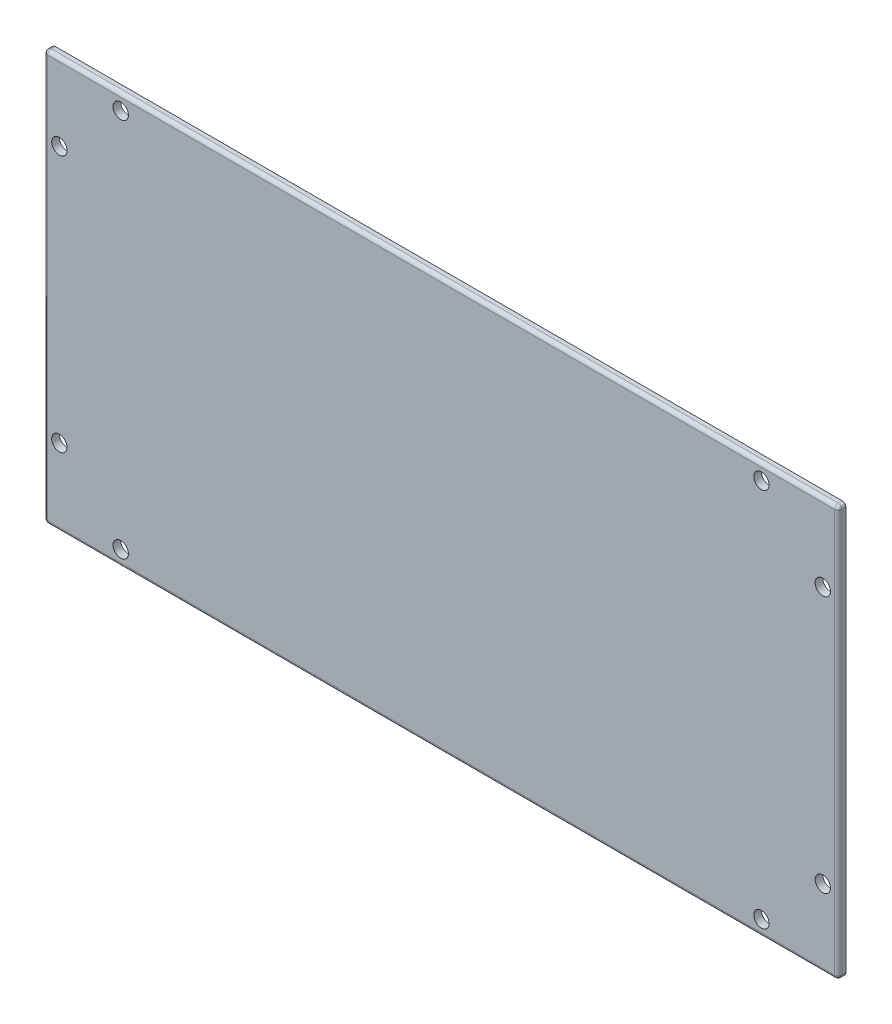
ISO-10303-21;
HEADER;
FILE_DESCRIPTION(('STEP AP214'),'2;1');
FILE_NAME('part.step','',(''),(''),'','','');
FILE_SCHEMA(('AUTOMOTIVE_DESIGN { 1 0 10303 214 1 1 1 1 }'));
ENDSEC;
DATA;
#1=APPLICATION_CONTEXT('core data for automotive mechanical design processes');
#2=APPLICATION_PROTOCOL_DEFINITION('international standard','automotive_design',2000,#1);
#3=PRODUCT_CONTEXT('',#1,'mechanical');
#4=PRODUCT('Part','Part','',(#3));
#5=PRODUCT_RELATED_PRODUCT_CATEGORY('part','',(#4));
#6=PRODUCT_DEFINITION_FORMATION('','',#4);
#7=PRODUCT_DEFINITION_CONTEXT('part definition',#1,'design');
#8=PRODUCT_DEFINITION('design','',#6,#7);
#9=PRODUCT_DEFINITION_SHAPE('','',#8);
#10=(LENGTH_UNIT() NAMED_UNIT(*) SI_UNIT(.MILLI.,.METRE.));
#11=(NAMED_UNIT(*) PLANE_ANGLE_UNIT() SI_UNIT($,.RADIAN.));
#12=(NAMED_UNIT(*) SI_UNIT($,.STERADIAN.) SOLID_ANGLE_UNIT());
#13=UNCERTAINTY_MEASURE_WITH_UNIT(LENGTH_MEASURE(1.E-05),#10,'distance_accuracy_value','');
#14=(GEOMETRIC_REPRESENTATION_CONTEXT(3) GLOBAL_UNCERTAINTY_ASSIGNED_CONTEXT((#13)) GLOBAL_UNIT_ASSIGNED_CONTEXT((#10,
#11,#12)) REPRESENTATION_CONTEXT('',''));
#15=CARTESIAN_POINT('',(0.,0.,0.));
#16=DIRECTION('',(0.,0.,1.));
#17=DIRECTION('',(1.,0.,0.));
#18=AXIS2_PLACEMENT_3D('',#15,#16,#17);
#19=CARTESIAN_POINT('',(0.,0.,0.));
#20=DIRECTION('',(0.,0.,1.));
#21=DIRECTION('',(1.,0.,0.));
#22=AXIS2_PLACEMENT_3D('',#19,#20,#21);
#23=PLANE('',#22);
#24=CARTESIAN_POINT('',(-497.4625,167.4625,0.));
#25=DIRECTION('',(0.,0.,-1.));
#26=DIRECTION('',(-1.,0.,0.));
#27=AXIS2_PLACEMENT_3D('',#24,#25,#26);
#28=CIRCLE('',#27,10.);
#29=CARTESIAN_POINT('',(-507.4625,167.4625,0.));
#30=VERTEX_POINT('',#29);
#31=EDGE_CURVE('E555',#30,#30,#28,.T.);
#32=ORIENTED_EDGE('',*,*,#31,.F.);
#33=EDGE_LOOP('',(#32));
#34=FACE_BOUND('',#33,.T.);
#35=CARTESIAN_POINT('',(-417.4625,-247.4625,0.));
#36=DIRECTION('',(0.,0.,-1.));
#37=DIRECTION('',(-1.,0.,0.));
#38=AXIS2_PLACEMENT_3D('',#35,#36,#37);
#39=CIRCLE('',#38,10.);
#40=CARTESIAN_POINT('',(-427.4625,-247.4625,0.));
#41=VERTEX_POINT('',#40);
#42=EDGE_CURVE('E563',#41,#41,#39,.T.);
#43=ORIENTED_EDGE('',*,*,#42,.F.);
#44=EDGE_LOOP('',(#43));
#45=FACE_BOUND('',#44,.T.);
#46=CARTESIAN_POINT('',(-497.4625,-167.4625,0.));
#47=DIRECTION('',(0.,0.,-1.));
#48=DIRECTION('',(-1.,0.,0.));
#49=AXIS2_PLACEMENT_3D('',#46,#47,#48);
#50=CIRCLE('',#49,10.);
#51=CARTESIAN_POINT('',(-507.4625,-167.4625,0.));
#52=VERTEX_POINT('',#51);
#53=EDGE_CURVE('E569',#52,#52,#50,.T.);
#54=ORIENTED_EDGE('',*,*,#53,.F.);
#55=EDGE_LOOP('',(#54));
#56=FACE_BOUND('',#55,.T.);
#57=CARTESIAN_POINT('',(497.4625,-167.4625,0.));
#58=DIRECTION('',(0.,0.,-1.));
#59=DIRECTION('',(-1.,0.,0.));
#60=AXIS2_PLACEMENT_3D('',#57,#58,#59);
#61=CIRCLE('',#60,10.);
#62=CARTESIAN_POINT('',(487.4625,-167.4625,0.));
#63=VERTEX_POINT('',#62);
#64=EDGE_CURVE('E581',#63,#63,#61,.T.);
#65=ORIENTED_EDGE('',*,*,#64,.F.);
#66=EDGE_LOOP('',(#65));
#67=FACE_BOUND('',#66,.T.);
#68=CARTESIAN_POINT('',(417.4625,247.4625,0.));
#69=DIRECTION('',(0.,0.,-1.));
#70=DIRECTION('',(-1.,0.,0.));
#71=AXIS2_PLACEMENT_3D('',#68,#69,#70);
#72=CIRCLE('',#71,10.);
#73=CARTESIAN_POINT('',(407.4625,247.4625,0.));
#74=VERTEX_POINT('',#73);
#75=EDGE_CURVE('E587',#74,#74,#72,.T.);
#76=ORIENTED_EDGE('',*,*,#75,.F.);
#77=EDGE_LOOP('',(#76));
#78=FACE_BOUND('',#77,.T.);
#79=CARTESIAN_POINT('',(497.4625,167.4625,0.));
#80=DIRECTION('',(0.,0.,-1.));
#81=DIRECTION('',(-1.,0.,0.));
#82=AXIS2_PLACEMENT_3D('',#79,#80,#81);
#83=CIRCLE('',#82,10.);
#84=CARTESIAN_POINT('',(487.4625,167.4625,0.));
#85=VERTEX_POINT('',#84);
#86=EDGE_CURVE('E209',#85,#85,#83,.T.);
#87=ORIENTED_EDGE('',*,*,#86,.F.);
#88=EDGE_LOOP('',(#87));
#89=FACE_BOUND('',#88,.T.);
#90=DIRECTION('',(0.,1.,0.));
#91=VECTOR('',#90,1.);
#92=CARTESIAN_POINT('',(517.4625,-267.4625,0.));
#93=LINE('',#92,#91);
#94=CARTESIAN_POINT('',(517.4625,-262.7025,0.));
#95=VERTEX_POINT('',#94);
#96=CARTESIAN_POINT('',(517.4625,262.7025,0.));
#97=VERTEX_POINT('',#96);
#98=EDGE_CURVE('E219',#95,#97,#93,.T.);
#99=ORIENTED_EDGE('',*,*,#98,.F.);
#100=CARTESIAN_POINT('',(512.7025,-262.7025,0.));
#101=DIRECTION('',(0.,0.,1.));
#102=DIRECTION('',(1.,0.,0.));
#103=AXIS2_PLACEMENT_3D('',#100,#101,#102);
#104=CIRCLE('',#103,4.76);
#105=CARTESIAN_POINT('',(512.7025,-267.4625,0.));
#106=VERTEX_POINT('',#105);
#107=EDGE_CURVE('E187',#95,#106,#104,.F.);
#108=ORIENTED_EDGE('',*,*,#107,.T.);
#109=DIRECTION('',(1.,0.,0.));
#110=VECTOR('',#109,1.);
#111=CARTESIAN_POINT('',(-517.4625,-267.4625,0.));
#112=LINE('',#111,#110);
#113=CARTESIAN_POINT('',(-512.7025,-267.4625,0.));
#114=VERTEX_POINT('',#113);
#115=EDGE_CURVE('E201',#114,#106,#112,.T.);
#116=ORIENTED_EDGE('',*,*,#115,.F.);
#117=CARTESIAN_POINT('',(-512.7025,-262.7025,0.));
#118=DIRECTION('',(0.,0.,1.));
#119=DIRECTION('',(1.,0.,0.));
#120=AXIS2_PLACEMENT_3D('',#117,#118,#119);
#121=CIRCLE('',#120,4.76);
#122=CARTESIAN_POINT('',(-517.4625,-262.7025,0.));
#123=VERTEX_POINT('',#122);
#124=EDGE_CURVE('E184',#114,#123,#121,.F.);
#125=ORIENTED_EDGE('',*,*,#124,.T.);
#126=DIRECTION('',(0.,1.,0.));
#127=VECTOR('',#126,1.);
#128=CARTESIAN_POINT('',(-517.4625,-267.4625,0.));
#129=LINE('',#128,#127);
#130=CARTESIAN_POINT('',(-517.4625,262.7025,0.));
#131=VERTEX_POINT('',#130);
#132=EDGE_CURVE('E224',#123,#131,#129,.T.);
#133=ORIENTED_EDGE('',*,*,#132,.T.);
#134=CARTESIAN_POINT('',(-512.7025,262.7025,0.));
#135=DIRECTION('',(0.,0.,1.));
#136=DIRECTION('',(1.,0.,0.));
#137=AXIS2_PLACEMENT_3D('',#134,#135,#136);
#138=CIRCLE('',#137,4.76);
#139=CARTESIAN_POINT('',(-512.7025,267.4625,0.));
#140=VERTEX_POINT('',#139);
#141=EDGE_CURVE('E61',#131,#140,#138,.F.);
#142=ORIENTED_EDGE('',*,*,#141,.T.);
#143=DIRECTION('',(1.,0.,0.));
#144=VECTOR('',#143,1.);
#145=CARTESIAN_POINT('',(-517.4625,267.4625,0.));
#146=LINE('',#145,#144);
#147=CARTESIAN_POINT('',(512.7025,267.4625,0.));
#148=VERTEX_POINT('',#147);
#149=EDGE_CURVE('E222',#140,#148,#146,.T.);
#150=ORIENTED_EDGE('',*,*,#149,.T.);
#151=CARTESIAN_POINT('',(512.7025,262.7025,0.));
#152=DIRECTION('',(0.,0.,1.));
#153=DIRECTION('',(1.,0.,0.));
#154=AXIS2_PLACEMENT_3D('',#151,#152,#153);
#155=CIRCLE('',#154,4.76);
#156=EDGE_CURVE('E182',#148,#97,#155,.F.);
#157=ORIENTED_EDGE('',*,*,#156,.T.);
#158=EDGE_LOOP('',(#99,#108,#116,#125,#133,#142,#150,#157));
#159=FACE_BOUND('',#158,.T.);
#160=CARTESIAN_POINT('',(417.4625,-247.4625,0.));
#161=DIRECTION('',(0.,0.,-1.));
#162=DIRECTION('',(-1.,0.,0.));
#163=AXIS2_PLACEMENT_3D('',#160,#161,#162);
#164=CIRCLE('',#163,10.);
#165=CARTESIAN_POINT('',(407.4625,-247.4625,0.));
#166=VERTEX_POINT('',#165);
#167=EDGE_CURVE('E575',#166,#166,#164,.T.);
#168=ORIENTED_EDGE('',*,*,#167,.F.);
#169=EDGE_LOOP('',(#168));
#170=FACE_BOUND('',#169,.T.);
#171=CARTESIAN_POINT('',(-417.4625,247.4625,0.));
#172=DIRECTION('',(0.,0.,-1.));
#173=DIRECTION('',(-1.,0.,0.));
#174=AXIS2_PLACEMENT_3D('',#171,#172,#173);
#175=CIRCLE('',#174,10.);
#176=CARTESIAN_POINT('',(-427.4625,247.4625,0.));
#177=VERTEX_POINT('',#176);
#178=EDGE_CURVE('E552',#177,#177,#175,.T.);
#179=ORIENTED_EDGE('',*,*,#178,.F.);
#180=EDGE_LOOP('',(#179));
#181=FACE_BOUND('',#180,.T.);
#182=ADVANCED_FACE('F38',(#34,#45,#56,#67,#78,#89,#159,#170,#181),#23,.F.);
#183=CARTESIAN_POINT('',(0.,0.,10.));
#184=DIRECTION('',(0.,0.,1.));
#185=DIRECTION('',(1.,0.,0.));
#186=AXIS2_PLACEMENT_3D('',#183,#184,#185);
#187=PLANE('',#186);
#188=CARTESIAN_POINT('',(-417.4625,247.4625,10.));
#189=DIRECTION('',(0.,0.,-1.));
#190=DIRECTION('',(-1.,0.,0.));
#191=AXIS2_PLACEMENT_3D('',#188,#189,#190);
#192=CIRCLE('',#191,10.);
#193=CARTESIAN_POINT('',(-427.4625,247.4625,10.));
#194=VERTEX_POINT('',#193);
#195=EDGE_CURVE('E549',#194,#194,#192,.T.);
#196=ORIENTED_EDGE('',*,*,#195,.T.);
#197=EDGE_LOOP('',(#196));
#198=FACE_BOUND('',#197,.T.);
#199=CARTESIAN_POINT('',(-497.4625,167.4625,10.));
#200=DIRECTION('',(0.,0.,-1.));
#201=DIRECTION('',(-1.,0.,0.));
#202=AXIS2_PLACEMENT_3D('',#199,#200,#201);
#203=CIRCLE('',#202,10.);
#204=CARTESIAN_POINT('',(-507.4625,167.4625,10.));
#205=VERTEX_POINT('',#204);
#206=EDGE_CURVE('E560',#205,#205,#203,.T.);
#207=ORIENTED_EDGE('',*,*,#206,.T.);
#208=EDGE_LOOP('',(#207));
#209=FACE_BOUND('',#208,.T.);
#210=DIRECTION('',(1.,0.,0.));
#211=VECTOR('',#210,1.);
#212=CARTESIAN_POINT('',(0.,262.7025,10.));
#213=LINE('',#212,#211);
#214=CARTESIAN_POINT('',(512.7025,262.7025,10.));
#215=VERTEX_POINT('',#214);
#216=CARTESIAN_POINT('',(-512.7025,262.7025,10.));
#217=VERTEX_POINT('',#216);
#218=EDGE_CURVE('E157',#215,#217,#213,.F.);
#219=ORIENTED_EDGE('',*,*,#218,.T.);
#220=DIRECTION('',(0.,1.,0.));
#221=VECTOR('',#220,1.);
#222=CARTESIAN_POINT('',(-512.7025,0.,10.));
#223=LINE('',#222,#221);
#224=CARTESIAN_POINT('',(-512.7025,-262.7025,10.));
#225=VERTEX_POINT('',#224);
#226=EDGE_CURVE('E136',#217,#225,#223,.F.);
#227=ORIENTED_EDGE('',*,*,#226,.T.);
#228=DIRECTION('',(1.,0.,0.));
#229=VECTOR('',#228,1.);
#230=CARTESIAN_POINT('',(517.4625,-262.7025,10.));
#231=LINE('',#230,#229);
#232=CARTESIAN_POINT('',(512.7025,-262.7025,10.));
#233=VERTEX_POINT('',#232);
#234=EDGE_CURVE('E145',#225,#233,#231,.T.);
#235=ORIENTED_EDGE('',*,*,#234,.T.);
#236=DIRECTION('',(0.,1.,0.));
#237=VECTOR('',#236,1.);
#238=CARTESIAN_POINT('',(512.7025,267.4625,10.));
#239=LINE('',#238,#237);
#240=EDGE_CURVE('E151',#233,#215,#239,.T.);
#241=ORIENTED_EDGE('',*,*,#240,.T.);
#242=EDGE_LOOP('',(#219,#227,#235,#241));
#243=FACE_BOUND('',#242,.T.);
#244=CARTESIAN_POINT('',(497.4625,167.4625,10.));
#245=DIRECTION('',(0.,0.,-1.));
#246=DIRECTION('',(-1.,0.,0.));
#247=AXIS2_PLACEMENT_3D('',#244,#245,#246);
#248=CIRCLE('',#247,10.);
#249=CARTESIAN_POINT('',(487.4625,167.4625,10.));
#250=VERTEX_POINT('',#249);
#251=EDGE_CURVE('E203',#250,#250,#248,.T.);
#252=ORIENTED_EDGE('',*,*,#251,.T.);
#253=EDGE_LOOP('',(#252));
#254=FACE_BOUND('',#253,.T.);
#255=CARTESIAN_POINT('',(417.4625,247.4625,10.));
#256=DIRECTION('',(0.,0.,-1.));
#257=DIRECTION('',(-1.,0.,0.));
#258=AXIS2_PLACEMENT_3D('',#255,#256,#257);
#259=CIRCLE('',#258,10.);
#260=CARTESIAN_POINT('',(407.4625,247.4625,10.));
#261=VERTEX_POINT('',#260);
#262=EDGE_CURVE('E213',#261,#261,#259,.T.);
#263=ORIENTED_EDGE('',*,*,#262,.T.);
#264=EDGE_LOOP('',(#263));
#265=FACE_BOUND('',#264,.T.);
#266=CARTESIAN_POINT('',(497.4625,-167.4625,10.));
#267=DIRECTION('',(0.,0.,-1.));
#268=DIRECTION('',(-1.,0.,0.));
#269=AXIS2_PLACEMENT_3D('',#266,#267,#268);
#270=CIRCLE('',#269,10.);
#271=CARTESIAN_POINT('',(487.4625,-167.4625,10.));
#272=VERTEX_POINT('',#271);
#273=EDGE_CURVE('E584',#272,#272,#270,.T.);
#274=ORIENTED_EDGE('',*,*,#273,.T.);
#275=EDGE_LOOP('',(#274));
#276=FACE_BOUND('',#275,.T.);
#277=CARTESIAN_POINT('',(417.4625,-247.4625,10.));
#278=DIRECTION('',(0.,0.,-1.));
#279=DIRECTION('',(-1.,0.,0.));
#280=AXIS2_PLACEMENT_3D('',#277,#278,#279);
#281=CIRCLE('',#280,10.);
#282=CARTESIAN_POINT('',(407.4625,-247.4625,10.));
#283=VERTEX_POINT('',#282);
#284=EDGE_CURVE('E578',#283,#283,#281,.T.);
#285=ORIENTED_EDGE('',*,*,#284,.T.);
#286=EDGE_LOOP('',(#285));
#287=FACE_BOUND('',#286,.T.);
#288=CARTESIAN_POINT('',(-497.4625,-167.4625,10.));
#289=DIRECTION('',(0.,0.,-1.));
#290=DIRECTION('',(-1.,0.,0.));
#291=AXIS2_PLACEMENT_3D('',#288,#289,#290);
#292=CIRCLE('',#291,10.);
#293=CARTESIAN_POINT('',(-507.4625,-167.4625,10.));
#294=VERTEX_POINT('',#293);
#295=EDGE_CURVE('E572',#294,#294,#292,.T.);
#296=ORIENTED_EDGE('',*,*,#295,.T.);
#297=EDGE_LOOP('',(#296));
#298=FACE_BOUND('',#297,.T.);
#299=CARTESIAN_POINT('',(-417.4625,-247.4625,10.));
#300=DIRECTION('',(0.,0.,-1.));
#301=DIRECTION('',(-1.,0.,0.));
#302=AXIS2_PLACEMENT_3D('',#299,#300,#301);
#303=CIRCLE('',#302,10.);
#304=CARTESIAN_POINT('',(-427.4625,-247.4625,10.));
#305=VERTEX_POINT('',#304);
#306=EDGE_CURVE('E566',#305,#305,#303,.T.);
#307=ORIENTED_EDGE('',*,*,#306,.T.);
#308=EDGE_LOOP('',(#307));
#309=FACE_BOUND('',#308,.T.);
#310=ADVANCED_FACE('F154',(#198,#209,#243,#254,#265,#276,#287,#298,#309),#187,.T.);
#311=CARTESIAN_POINT('',(-517.4625,-267.4625,10.));
#312=DIRECTION('',(0.,1.,0.));
#313=DIRECTION('',(0.,0.,1.));
#314=AXIS2_PLACEMENT_3D('',#311,#312,#313);
#315=PLANE('',#314);
#316=ORIENTED_EDGE('',*,*,#115,.T.);
#317=DIRECTION('',(0.,0.,-1.));
#318=VECTOR('',#317,1.);
#319=CARTESIAN_POINT('',(512.7025,-267.4625,10.));
#320=LINE('',#319,#318);
#321=CARTESIAN_POINT('',(512.7025,-267.4625,5.24));
#322=VERTEX_POINT('',#321);
#323=EDGE_CURVE('E191',#106,#322,#320,.F.);
#324=ORIENTED_EDGE('',*,*,#323,.T.);
#325=DIRECTION('',(1.,0.,0.));
#326=VECTOR('',#325,1.);
#327=CARTESIAN_POINT('',(-517.4625,-267.4625,5.24));
#328=LINE('',#327,#326);
#329=CARTESIAN_POINT('',(-512.7025,-267.4625,5.24));
#330=VERTEX_POINT('',#329);
#331=EDGE_CURVE('E128',#322,#330,#328,.F.);
#332=ORIENTED_EDGE('',*,*,#331,.T.);
#333=DIRECTION('',(0.,0.,-1.));
#334=VECTOR('',#333,1.);
#335=CARTESIAN_POINT('',(-512.7025,-267.4625,0.));
#336=LINE('',#335,#334);
#337=EDGE_CURVE('E189',#330,#114,#336,.T.);
#338=ORIENTED_EDGE('',*,*,#337,.T.);
#339=EDGE_LOOP('',(#316,#324,#332,#338));
#340=FACE_BOUND('',#339,.T.);
#341=ADVANCED_FACE('F267',(#340),#315,.F.);
#342=CARTESIAN_POINT('',(517.4625,-267.4625,10.));
#343=DIRECTION('',(-1.,0.,0.));
#344=DIRECTION('',(0.,0.,1.));
#345=AXIS2_PLACEMENT_3D('',#342,#343,#344);
#346=PLANE('',#345);
#347=DIRECTION('',(0.,1.,0.));
#348=VECTOR('',#347,1.);
#349=CARTESIAN_POINT('',(517.4625,-267.4625,5.24));
#350=LINE('',#349,#348);
#351=CARTESIAN_POINT('',(517.4625,262.7025,5.24));
#352=VERTEX_POINT('',#351);
#353=CARTESIAN_POINT('',(517.4625,-262.7025,5.24));
#354=VERTEX_POINT('',#353);
#355=EDGE_CURVE('E160',#352,#354,#350,.F.);
#356=ORIENTED_EDGE('',*,*,#355,.T.);
#357=DIRECTION('',(0.,0.,-1.));
#358=VECTOR('',#357,1.);
#359=CARTESIAN_POINT('',(517.4625,-262.7025,10.));
#360=LINE('',#359,#358);
#361=EDGE_CURVE('E180',#354,#95,#360,.T.);
#362=ORIENTED_EDGE('',*,*,#361,.T.);
#363=ORIENTED_EDGE('',*,*,#98,.T.);
#364=DIRECTION('',(0.,0.,-1.));
#365=VECTOR('',#364,1.);
#366=CARTESIAN_POINT('',(517.4625,262.7025,5.24));
#367=LINE('',#366,#365);
#368=EDGE_CURVE('E178',#97,#352,#367,.F.);
#369=ORIENTED_EDGE('',*,*,#368,.T.);
#370=EDGE_LOOP('',(#356,#362,#363,#369));
#371=FACE_BOUND('',#370,.T.);
#372=ADVANCED_FACE('F240',(#371),#346,.F.);
#373=CARTESIAN_POINT('',(-517.4625,267.4625,10.));
#374=DIRECTION('',(0.,1.,0.));
#375=DIRECTION('',(0.,0.,1.));
#376=AXIS2_PLACEMENT_3D('',#373,#374,#375);
#377=PLANE('',#376);
#378=ORIENTED_EDGE('',*,*,#149,.F.);
#379=DIRECTION('',(0.,0.,-1.));
#380=VECTOR('',#379,1.);
#381=CARTESIAN_POINT('',(-512.7025,267.4625,10.));
#382=LINE('',#381,#380);
#383=CARTESIAN_POINT('',(-512.7025,267.4625,5.24));
#384=VERTEX_POINT('',#383);
#385=EDGE_CURVE('E11',#140,#384,#382,.F.);
#386=ORIENTED_EDGE('',*,*,#385,.T.);
#387=DIRECTION('',(1.,0.,0.));
#388=VECTOR('',#387,1.);
#389=CARTESIAN_POINT('',(-517.4625,267.4625,5.24));
#390=LINE('',#389,#388);
#391=CARTESIAN_POINT('',(512.7025,267.4625,5.24));
#392=VERTEX_POINT('',#391);
#393=EDGE_CURVE('E158',#384,#392,#390,.T.);
#394=ORIENTED_EDGE('',*,*,#393,.T.);
#395=DIRECTION('',(0.,0.,-1.));
#396=VECTOR('',#395,1.);
#397=CARTESIAN_POINT('',(512.7025,267.4625,0.));
#398=LINE('',#397,#396);
#399=EDGE_CURVE('E47',#392,#148,#398,.T.);
#400=ORIENTED_EDGE('',*,*,#399,.T.);
#401=EDGE_LOOP('',(#378,#386,#394,#400));
#402=FACE_BOUND('',#401,.T.);
#403=ADVANCED_FACE('F257',(#402),#377,.T.);
#404=CARTESIAN_POINT('',(-517.4625,-267.4625,10.));
#405=DIRECTION('',(-1.,0.,0.));
#406=DIRECTION('',(0.,0.,1.));
#407=AXIS2_PLACEMENT_3D('',#404,#405,#406);
#408=PLANE('',#407);
#409=DIRECTION('',(0.,1.,0.));
#410=VECTOR('',#409,1.);
#411=CARTESIAN_POINT('',(-517.4625,-267.4625,5.24));
#412=LINE('',#411,#410);
#413=CARTESIAN_POINT('',(-517.4625,-262.7025,5.24));
#414=VERTEX_POINT('',#413);
#415=CARTESIAN_POINT('',(-517.4625,262.7025,5.24));
#416=VERTEX_POINT('',#415);
#417=EDGE_CURVE('E139',#414,#416,#412,.T.);
#418=ORIENTED_EDGE('',*,*,#417,.T.);
#419=DIRECTION('',(0.,0.,-1.));
#420=VECTOR('',#419,1.);
#421=CARTESIAN_POINT('',(-517.4625,262.7025,10.));
#422=LINE('',#421,#420);
#423=EDGE_CURVE('E195',#416,#131,#422,.T.);
#424=ORIENTED_EDGE('',*,*,#423,.T.);
#425=ORIENTED_EDGE('',*,*,#132,.F.);
#426=DIRECTION('',(0.,0.,-1.));
#427=VECTOR('',#426,1.);
#428=CARTESIAN_POINT('',(-517.4625,-262.7025,5.24));
#429=LINE('',#428,#427);
#430=EDGE_CURVE('E193',#123,#414,#429,.F.);
#431=ORIENTED_EDGE('',*,*,#430,.T.);
#432=EDGE_LOOP('',(#418,#424,#425,#431));
#433=FACE_BOUND('',#432,.T.);
#434=ADVANCED_FACE('F250',(#433),#408,.T.);
#435=CARTESIAN_POINT('',(512.7025,0.,5.24));
#436=DIRECTION('',(0.,-1.,0.));
#437=DIRECTION('',(0.,0.,-1.));
#438=AXIS2_PLACEMENT_3D('',#435,#436,#437);
#439=CYLINDRICAL_SURFACE('',#438,4.76);
#440=ORIENTED_EDGE('',*,*,#240,.F.);
#441=CARTESIAN_POINT('',(512.7025,-262.7025,5.24));
#442=DIRECTION('',(0.,-1.,0.));
#443=DIRECTION('',(0.,0.,-1.));
#444=AXIS2_PLACEMENT_3D('',#441,#442,#443);
#445=CIRCLE('',#444,4.76);
#446=EDGE_CURVE('E141',#233,#354,#445,.F.);
#447=ORIENTED_EDGE('',*,*,#446,.T.);
#448=ORIENTED_EDGE('',*,*,#355,.F.);
#449=CARTESIAN_POINT('',(512.7025,262.7025,5.24));
#450=DIRECTION('',(0.,-1.,0.));
#451=DIRECTION('',(0.,0.,-1.));
#452=AXIS2_PLACEMENT_3D('',#449,#450,#451);
#453=CIRCLE('',#452,4.76);
#454=EDGE_CURVE('E169',#352,#215,#453,.T.);
#455=ORIENTED_EDGE('',*,*,#454,.T.);
#456=EDGE_LOOP('',(#440,#447,#448,#455));
#457=FACE_BOUND('',#456,.T.);
#458=ADVANCED_FACE('F248',(#457),#439,.T.);
#459=CARTESIAN_POINT('',(0.,-262.7025,5.24));
#460=DIRECTION('',(-1.,0.,0.));
#461=DIRECTION('',(0.,0.,1.));
#462=AXIS2_PLACEMENT_3D('',#459,#460,#461);
#463=CYLINDRICAL_SURFACE('',#462,4.76);
#464=ORIENTED_EDGE('',*,*,#331,.F.);
#465=CARTESIAN_POINT('',(512.7025,-262.7025,5.24));
#466=DIRECTION('',(-1.,0.,0.));
#467=DIRECTION('',(0.,0.,1.));
#468=AXIS2_PLACEMENT_3D('',#465,#466,#467);
#469=CIRCLE('',#468,4.76);
#470=EDGE_CURVE('E127',#322,#233,#469,.T.);
#471=ORIENTED_EDGE('',*,*,#470,.T.);
#472=ORIENTED_EDGE('',*,*,#234,.F.);
#473=CARTESIAN_POINT('',(-512.7025,-262.7025,5.24));
#474=DIRECTION('',(-1.,0.,0.));
#475=DIRECTION('',(0.,0.,1.));
#476=AXIS2_PLACEMENT_3D('',#473,#474,#475);
#477=CIRCLE('',#476,4.76);
#478=EDGE_CURVE('E117',#225,#330,#477,.F.);
#479=ORIENTED_EDGE('',*,*,#478,.T.);
#480=EDGE_LOOP('',(#464,#471,#472,#479));
#481=FACE_BOUND('',#480,.T.);
#482=ADVANCED_FACE('F146',(#481),#463,.T.);
#483=CARTESIAN_POINT('',(-517.4625,262.7025,5.24));
#484=DIRECTION('',(1.,0.,0.));
#485=DIRECTION('',(0.,0.,-1.));
#486=AXIS2_PLACEMENT_3D('',#483,#484,#485);
#487=CYLINDRICAL_SURFACE('',#486,4.76);
#488=ORIENTED_EDGE('',*,*,#393,.F.);
#489=CARTESIAN_POINT('',(-512.7025,262.7025,5.24));
#490=DIRECTION('',(1.,0.,0.));
#491=DIRECTION('',(0.,0.,-1.));
#492=AXIS2_PLACEMENT_3D('',#489,#490,#491);
#493=CIRCLE('',#492,4.76);
#494=EDGE_CURVE('E176',#384,#217,#493,.T.);
#495=ORIENTED_EDGE('',*,*,#494,.T.);
#496=ORIENTED_EDGE('',*,*,#218,.F.);
#497=CARTESIAN_POINT('',(512.7025,262.7025,5.24));
#498=DIRECTION('',(1.,0.,0.));
#499=DIRECTION('',(0.,0.,-1.));
#500=AXIS2_PLACEMENT_3D('',#497,#498,#499);
#501=CIRCLE('',#500,4.76);
#502=EDGE_CURVE('E173',#215,#392,#501,.F.);
#503=ORIENTED_EDGE('',*,*,#502,.T.);
#504=EDGE_LOOP('',(#488,#495,#496,#503));
#505=FACE_BOUND('',#504,.T.);
#506=ADVANCED_FACE('F229',(#505),#487,.T.);
#507=CARTESIAN_POINT('',(-512.7025,-267.4625,5.24));
#508=DIRECTION('',(0.,1.,0.));
#509=DIRECTION('',(0.,0.,1.));
#510=AXIS2_PLACEMENT_3D('',#507,#508,#509);
#511=CYLINDRICAL_SURFACE('',#510,4.76);
#512=ORIENTED_EDGE('',*,*,#226,.F.);
#513=CARTESIAN_POINT('',(-512.7025,262.7025,5.24));
#514=DIRECTION('',(0.,1.,0.));
#515=DIRECTION('',(0.,0.,1.));
#516=AXIS2_PLACEMENT_3D('',#513,#514,#515);
#517=CIRCLE('',#516,4.76);
#518=EDGE_CURVE('E140',#217,#416,#517,.F.);
#519=ORIENTED_EDGE('',*,*,#518,.T.);
#520=ORIENTED_EDGE('',*,*,#417,.F.);
#521=CARTESIAN_POINT('',(-512.7025,-262.7025,5.24));
#522=DIRECTION('',(0.,1.,0.));
#523=DIRECTION('',(0.,0.,1.));
#524=AXIS2_PLACEMENT_3D('',#521,#522,#523);
#525=CIRCLE('',#524,4.76);
#526=EDGE_CURVE('E120',#414,#225,#525,.T.);
#527=ORIENTED_EDGE('',*,*,#526,.T.);
#528=EDGE_LOOP('',(#512,#519,#520,#527));
#529=FACE_BOUND('',#528,.T.);
#530=ADVANCED_FACE('F133',(#529),#511,.T.);
#531=CARTESIAN_POINT('',(512.7025,-262.7025,10.));
#532=DIRECTION('',(0.,0.,-1.));
#533=DIRECTION('',(-1.,0.,0.));
#534=AXIS2_PLACEMENT_3D('',#531,#532,#533);
#535=CYLINDRICAL_SURFACE('',#534,4.76);
#536=ORIENTED_EDGE('',*,*,#107,.F.);
#537=ORIENTED_EDGE('',*,*,#361,.F.);
#538=CARTESIAN_POINT('',(512.7025,-262.7025,5.24));
#539=DIRECTION('',(0.,0.,1.));
#540=DIRECTION('',(1.,0.,0.));
#541=AXIS2_PLACEMENT_3D('',#538,#539,#540);
#542=CIRCLE('',#541,4.76);
#543=EDGE_CURVE('E198',#322,#354,#542,.T.);
#544=ORIENTED_EDGE('',*,*,#543,.F.);
#545=ORIENTED_EDGE('',*,*,#323,.F.);
#546=EDGE_LOOP('',(#536,#537,#544,#545));
#547=FACE_BOUND('',#546,.T.);
#548=ADVANCED_FACE('F244',(#547),#535,.T.);
#549=CARTESIAN_POINT('',(512.7025,-262.7025,5.24));
#550=DIRECTION('',(0.,0.,1.));
#551=DIRECTION('',(1.,0.,0.));
#552=AXIS2_PLACEMENT_3D('',#549,#550,#551);
#553=SPHERICAL_SURFACE('',#552,4.76);
#554=ORIENTED_EDGE('',*,*,#543,.T.);
#555=ORIENTED_EDGE('',*,*,#446,.F.);
#556=ORIENTED_EDGE('',*,*,#470,.F.);
#557=EDGE_LOOP('',(#554,#555,#556));
#558=FACE_BOUND('',#557,.T.);
#559=ADVANCED_FACE('F247',(#558),#553,.T.);
#560=CARTESIAN_POINT('',(-512.7025,262.7025,10.));
#561=DIRECTION('',(0.,0.,-1.));
#562=DIRECTION('',(-1.,0.,0.));
#563=AXIS2_PLACEMENT_3D('',#560,#561,#562);
#564=CYLINDRICAL_SURFACE('',#563,4.76);
#565=ORIENTED_EDGE('',*,*,#141,.F.);
#566=ORIENTED_EDGE('',*,*,#423,.F.);
#567=CARTESIAN_POINT('',(-512.7025,262.7025,5.24));
#568=DIRECTION('',(0.,0.,1.));
#569=DIRECTION('',(1.,0.,0.));
#570=AXIS2_PLACEMENT_3D('',#567,#568,#569);
#571=CIRCLE('',#570,4.76);
#572=EDGE_CURVE('E202',#384,#416,#571,.T.);
#573=ORIENTED_EDGE('',*,*,#572,.F.);
#574=ORIENTED_EDGE('',*,*,#385,.F.);
#575=EDGE_LOOP('',(#565,#566,#573,#574));
#576=FACE_BOUND('',#575,.T.);
#577=ADVANCED_FACE('F304',(#576),#564,.T.);
#578=CARTESIAN_POINT('',(-512.7025,262.7025,5.24));
#579=DIRECTION('',(0.,0.,1.));
#580=DIRECTION('',(1.,0.,0.));
#581=AXIS2_PLACEMENT_3D('',#578,#579,#580);
#582=SPHERICAL_SURFACE('',#581,4.76);
#583=ORIENTED_EDGE('',*,*,#518,.F.);
#584=ORIENTED_EDGE('',*,*,#494,.F.);
#585=ORIENTED_EDGE('',*,*,#572,.T.);
#586=EDGE_LOOP('',(#583,#584,#585));
#587=FACE_BOUND('',#586,.T.);
#588=ADVANCED_FACE('F310',(#587),#582,.T.);
#589=CARTESIAN_POINT('',(-512.7025,-262.7025,10.));
#590=DIRECTION('',(0.,0.,1.));
#591=DIRECTION('',(1.,0.,0.));
#592=AXIS2_PLACEMENT_3D('',#589,#590,#591);
#593=CYLINDRICAL_SURFACE('',#592,4.76);
#594=ORIENTED_EDGE('',*,*,#124,.F.);
#595=ORIENTED_EDGE('',*,*,#337,.F.);
#596=CARTESIAN_POINT('',(-512.7025,-262.7025,5.24));
#597=DIRECTION('',(0.,0.,1.));
#598=DIRECTION('',(1.,0.,0.));
#599=AXIS2_PLACEMENT_3D('',#596,#597,#598);
#600=CIRCLE('',#599,4.76);
#601=EDGE_CURVE('E122',#414,#330,#600,.T.);
#602=ORIENTED_EDGE('',*,*,#601,.F.);
#603=ORIENTED_EDGE('',*,*,#430,.F.);
#604=EDGE_LOOP('',(#594,#595,#602,#603));
#605=FACE_BOUND('',#604,.T.);
#606=ADVANCED_FACE('F318',(#605),#593,.T.);
#607=CARTESIAN_POINT('',(-512.7025,-262.7025,5.24));
#608=DIRECTION('',(0.,0.,1.));
#609=DIRECTION('',(1.,0.,0.));
#610=AXIS2_PLACEMENT_3D('',#607,#608,#609);
#611=SPHERICAL_SURFACE('',#610,4.76);
#612=ORIENTED_EDGE('',*,*,#601,.T.);
#613=ORIENTED_EDGE('',*,*,#478,.F.);
#614=ORIENTED_EDGE('',*,*,#526,.F.);
#615=EDGE_LOOP('',(#612,#613,#614));
#616=FACE_BOUND('',#615,.T.);
#617=ADVANCED_FACE('F119',(#616),#611,.T.);
#618=CARTESIAN_POINT('',(512.7025,262.7025,10.));
#619=DIRECTION('',(0.,0.,1.));
#620=DIRECTION('',(1.,0.,0.));
#621=AXIS2_PLACEMENT_3D('',#618,#619,#620);
#622=CYLINDRICAL_SURFACE('',#621,4.76);
#623=ORIENTED_EDGE('',*,*,#156,.F.);
#624=ORIENTED_EDGE('',*,*,#399,.F.);
#625=CARTESIAN_POINT('',(512.7025,262.7025,5.24));
#626=DIRECTION('',(0.,0.,1.));
#627=DIRECTION('',(1.,0.,0.));
#628=AXIS2_PLACEMENT_3D('',#625,#626,#627);
#629=CIRCLE('',#628,4.76);
#630=EDGE_CURVE('E42',#352,#392,#629,.T.);
#631=ORIENTED_EDGE('',*,*,#630,.F.);
#632=ORIENTED_EDGE('',*,*,#368,.F.);
#633=EDGE_LOOP('',(#623,#624,#631,#632));
#634=FACE_BOUND('',#633,.T.);
#635=ADVANCED_FACE('F40',(#634),#622,.T.);
#636=CARTESIAN_POINT('',(512.7025,262.7025,5.24));
#637=DIRECTION('',(0.,0.,1.));
#638=DIRECTION('',(1.,0.,0.));
#639=AXIS2_PLACEMENT_3D('',#636,#637,#638);
#640=SPHERICAL_SURFACE('',#639,4.76);
#641=ORIENTED_EDGE('',*,*,#502,.F.);
#642=ORIENTED_EDGE('',*,*,#454,.F.);
#643=ORIENTED_EDGE('',*,*,#630,.T.);
#644=EDGE_LOOP('',(#641,#642,#643));
#645=FACE_BOUND('',#644,.T.);
#646=ADVANCED_FACE('F231',(#645),#640,.T.);
#647=CARTESIAN_POINT('',(497.4625,167.4625,0.));
#648=DIRECTION('',(0.,0.,-1.));
#649=DIRECTION('',(-1.,0.,0.));
#650=AXIS2_PLACEMENT_3D('',#647,#648,#649);
#651=CYLINDRICAL_SURFACE('',#650,10.);
#652=ORIENTED_EDGE('',*,*,#251,.F.);
#653=EDGE_LOOP('',(#652));
#654=FACE_BOUND('',#653,.T.);
#655=ORIENTED_EDGE('',*,*,#86,.T.);
#656=EDGE_LOOP('',(#655));
#657=FACE_BOUND('',#656,.T.);
#658=ADVANCED_FACE('F344',(#654,#657),#651,.F.);
#659=CARTESIAN_POINT('',(417.4625,247.4625,0.));
#660=DIRECTION('',(0.,0.,-1.));
#661=DIRECTION('',(-1.,0.,0.));
#662=AXIS2_PLACEMENT_3D('',#659,#660,#661);
#663=CYLINDRICAL_SURFACE('',#662,10.);
#664=ORIENTED_EDGE('',*,*,#262,.F.);
#665=EDGE_LOOP('',(#664));
#666=FACE_BOUND('',#665,.T.);
#667=ORIENTED_EDGE('',*,*,#75,.T.);
#668=EDGE_LOOP('',(#667));
#669=FACE_BOUND('',#668,.T.);
#670=ADVANCED_FACE('F350',(#666,#669),#663,.F.);
#671=CARTESIAN_POINT('',(497.4625,-167.4625,0.));
#672=DIRECTION('',(0.,0.,-1.));
#673=DIRECTION('',(-1.,0.,0.));
#674=AXIS2_PLACEMENT_3D('',#671,#672,#673);
#675=CYLINDRICAL_SURFACE('',#674,10.);
#676=ORIENTED_EDGE('',*,*,#273,.F.);
#677=EDGE_LOOP('',(#676));
#678=FACE_BOUND('',#677,.T.);
#679=ORIENTED_EDGE('',*,*,#64,.T.);
#680=EDGE_LOOP('',(#679));
#681=FACE_BOUND('',#680,.T.);
#682=ADVANCED_FACE('F357',(#678,#681),#675,.F.);
#683=CARTESIAN_POINT('',(417.4625,-247.4625,0.));
#684=DIRECTION('',(0.,0.,-1.));
#685=DIRECTION('',(-1.,0.,0.));
#686=AXIS2_PLACEMENT_3D('',#683,#684,#685);
#687=CYLINDRICAL_SURFACE('',#686,10.);
#688=ORIENTED_EDGE('',*,*,#284,.F.);
#689=EDGE_LOOP('',(#688));
#690=FACE_BOUND('',#689,.T.);
#691=ORIENTED_EDGE('',*,*,#167,.T.);
#692=EDGE_LOOP('',(#691));
#693=FACE_BOUND('',#692,.T.);
#694=ADVANCED_FACE('F365',(#690,#693),#687,.F.);
#695=CARTESIAN_POINT('',(-497.4625,-167.4625,0.));
#696=DIRECTION('',(0.,0.,-1.));
#697=DIRECTION('',(-1.,0.,0.));
#698=AXIS2_PLACEMENT_3D('',#695,#696,#697);
#699=CYLINDRICAL_SURFACE('',#698,10.);
#700=ORIENTED_EDGE('',*,*,#295,.F.);
#701=EDGE_LOOP('',(#700));
#702=FACE_BOUND('',#701,.T.);
#703=ORIENTED_EDGE('',*,*,#53,.T.);
#704=EDGE_LOOP('',(#703));
#705=FACE_BOUND('',#704,.T.);
#706=ADVANCED_FACE('F373',(#702,#705),#699,.F.);
#707=CARTESIAN_POINT('',(-417.4625,-247.4625,0.));
#708=DIRECTION('',(0.,0.,-1.));
#709=DIRECTION('',(-1.,0.,0.));
#710=AXIS2_PLACEMENT_3D('',#707,#708,#709);
#711=CYLINDRICAL_SURFACE('',#710,10.);
#712=ORIENTED_EDGE('',*,*,#306,.F.);
#713=EDGE_LOOP('',(#712));
#714=FACE_BOUND('',#713,.T.);
#715=ORIENTED_EDGE('',*,*,#42,.T.);
#716=EDGE_LOOP('',(#715));
#717=FACE_BOUND('',#716,.T.);
#718=ADVANCED_FACE('F381',(#714,#717),#711,.F.);
#719=CARTESIAN_POINT('',(-497.4625,167.4625,0.));
#720=DIRECTION('',(0.,0.,-1.));
#721=DIRECTION('',(-1.,0.,0.));
#722=AXIS2_PLACEMENT_3D('',#719,#720,#721);
#723=CYLINDRICAL_SURFACE('',#722,10.);
#724=ORIENTED_EDGE('',*,*,#206,.F.);
#725=EDGE_LOOP('',(#724));
#726=FACE_BOUND('',#725,.T.);
#727=ORIENTED_EDGE('',*,*,#31,.T.);
#728=EDGE_LOOP('',(#727));
#729=FACE_BOUND('',#728,.T.);
#730=ADVANCED_FACE('F390',(#726,#729),#723,.F.);
#731=CARTESIAN_POINT('',(-417.4625,247.4625,0.));
#732=DIRECTION('',(0.,0.,-1.));
#733=DIRECTION('',(-1.,0.,0.));
#734=AXIS2_PLACEMENT_3D('',#731,#732,#733);
#735=CYLINDRICAL_SURFACE('',#734,10.);
#736=ORIENTED_EDGE('',*,*,#195,.F.);
#737=EDGE_LOOP('',(#736));
#738=FACE_BOUND('',#737,.T.);
#739=ORIENTED_EDGE('',*,*,#178,.T.);
#740=EDGE_LOOP('',(#739));
#741=FACE_BOUND('',#740,.T.);
#742=ADVANCED_FACE('F398',(#738,#741),#735,.F.);
#743=CLOSED_SHELL('',(#182,#310,#341,#372,#403,#434,#458,#482,#506,#530,#548,#559,#577,#588,
#606,#617,#635,#646,#658,#670,#682,#694,#706,#718,#730,#742));
#744=MANIFOLD_SOLID_BREP('B2',#743);
#745=ADVANCED_BREP_SHAPE_REPRESENTATION('',(#18,#744),#14);
#746=SHAPE_DEFINITION_REPRESENTATION(#9,#745);
ENDSEC;
END-ISO-10303-21;
